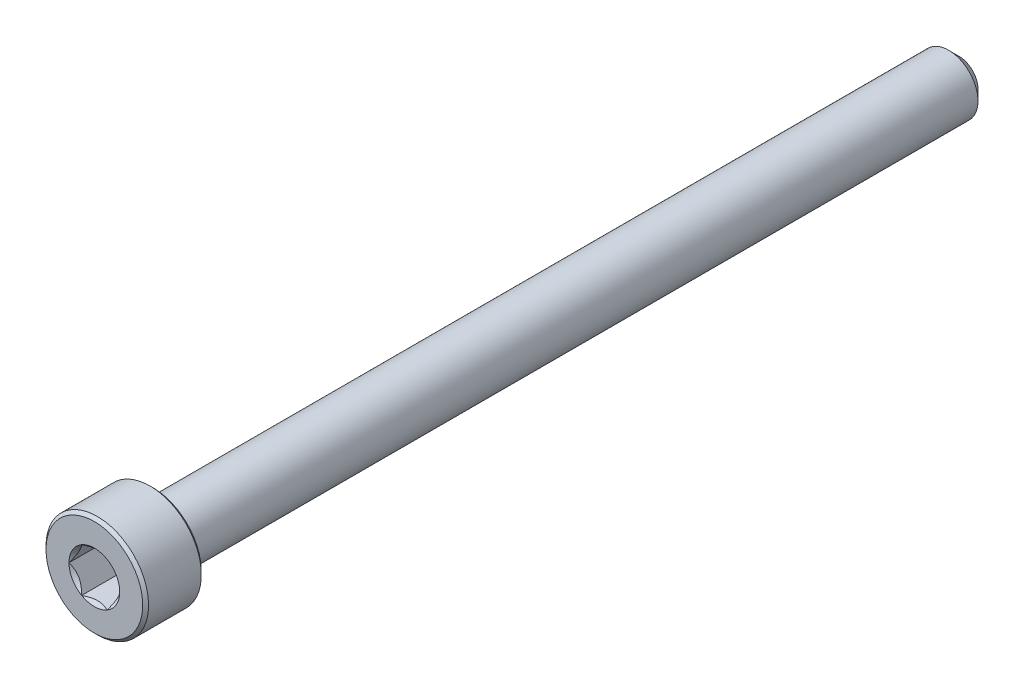
ISO-10303-21;
HEADER;
FILE_DESCRIPTION(('STEP AP214'),'2;1');
FILE_NAME('part.step','',(''),(''),'','','');
FILE_SCHEMA(('AUTOMOTIVE_DESIGN { 1 0 10303 214 1 1 1 1 }'));
ENDSEC;
DATA;
#1=APPLICATION_CONTEXT('core data for automotive mechanical design processes');
#2=APPLICATION_PROTOCOL_DEFINITION('international standard','automotive_design',2000,#1);
#3=PRODUCT_CONTEXT('',#1,'mechanical');
#4=PRODUCT('Part','Part','',(#3));
#5=PRODUCT_RELATED_PRODUCT_CATEGORY('part','',(#4));
#6=PRODUCT_DEFINITION_FORMATION('','',#4);
#7=PRODUCT_DEFINITION_CONTEXT('part definition',#1,'design');
#8=PRODUCT_DEFINITION('design','',#6,#7);
#9=PRODUCT_DEFINITION_SHAPE('','',#8);
#10=(LENGTH_UNIT() NAMED_UNIT(*) SI_UNIT(.MILLI.,.METRE.));
#11=(NAMED_UNIT(*) PLANE_ANGLE_UNIT() SI_UNIT($,.RADIAN.));
#12=(NAMED_UNIT(*) SI_UNIT($,.STERADIAN.) SOLID_ANGLE_UNIT());
#13=UNCERTAINTY_MEASURE_WITH_UNIT(LENGTH_MEASURE(1.E-05),#10,'distance_accuracy_value','');
#14=(GEOMETRIC_REPRESENTATION_CONTEXT(3) GLOBAL_UNCERTAINTY_ASSIGNED_CONTEXT((#13)) GLOBAL_UNIT_ASSIGNED_CONTEXT((#10,
#11,#12)) REPRESENTATION_CONTEXT('',''));
#15=CARTESIAN_POINT('',(0.,0.,0.));
#16=DIRECTION('',(0.,0.,1.));
#17=DIRECTION('',(1.,0.,0.));
#18=AXIS2_PLACEMENT_3D('',#15,#16,#17);
#19=CARTESIAN_POINT('',(0.,0.,29.5));
#20=DIRECTION('',(0.,0.,1.));
#21=DIRECTION('',(1.,0.,0.));
#22=AXIS2_PLACEMENT_3D('',#19,#20,#21);
#23=PLANE('',#22);
#24=CARTESIAN_POINT('',(0.,0.,29.5));
#25=DIRECTION('',(0.,0.,1.));
#26=DIRECTION('',(1.,0.,0.));
#27=AXIS2_PLACEMENT_3D('',#24,#25,#26);
#28=CIRCLE('',#27,1.73205080756888);
#29=CARTESIAN_POINT('',(1.73205080756888,0.,29.5));
#30=VERTEX_POINT('',#29);
#31=CARTESIAN_POINT('',(0.866025403784439,1.5,29.5));
#32=VERTEX_POINT('',#31);
#33=EDGE_CURVE('E112',#30,#32,#28,.T.);
#34=ORIENTED_EDGE('',*,*,#33,.F.);
#35=CARTESIAN_POINT('',(0.866025403784438,-1.5,29.5));
#36=VERTEX_POINT('',#35);
#37=EDGE_CURVE('E101',#36,#30,#28,.T.);
#38=ORIENTED_EDGE('',*,*,#37,.F.);
#39=CARTESIAN_POINT('',(-0.866025403784438,-1.5,29.5));
#40=VERTEX_POINT('',#39);
#41=EDGE_CURVE('E110',#40,#36,#28,.T.);
#42=ORIENTED_EDGE('',*,*,#41,.F.);
#43=CARTESIAN_POINT('',(-1.73205080756888,0.,29.5));
#44=VERTEX_POINT('',#43);
#45=EDGE_CURVE('E298',#44,#40,#28,.T.);
#46=ORIENTED_EDGE('',*,*,#45,.F.);
#47=CARTESIAN_POINT('',(-0.866025403784438,1.5,29.5));
#48=VERTEX_POINT('',#47);
#49=EDGE_CURVE('E138',#48,#44,#28,.T.);
#50=ORIENTED_EDGE('',*,*,#49,.F.);
#51=EDGE_CURVE('E135',#32,#48,#28,.T.);
#52=ORIENTED_EDGE('',*,*,#51,.F.);
#53=EDGE_LOOP('',(#34,#38,#42,#46,#50,#52));
#54=FACE_BOUND('',#53,.T.);
#55=CARTESIAN_POINT('',(0.,0.,29.5));
#56=DIRECTION('',(0.,0.,-1.));
#57=DIRECTION('',(-1.,0.,0.));
#58=AXIS2_PLACEMENT_3D('',#55,#56,#57);
#59=CIRCLE('',#58,3.3);
#60=CARTESIAN_POINT('',(-3.3,0.,29.5));
#61=VERTEX_POINT('',#60);
#62=EDGE_CURVE('E55',#61,#61,#59,.T.);
#63=ORIENTED_EDGE('',*,*,#62,.F.);
#64=EDGE_LOOP('',(#63));
#65=FACE_BOUND('',#64,.T.);
#66=ADVANCED_FACE('F41',(#54,#65),#23,.T.);
#67=CARTESIAN_POINT('',(0.,0.,29.3));
#68=DIRECTION('',(0.,0.,-1.));
#69=DIRECTION('',(-1.,0.,0.));
#70=AXIS2_PLACEMENT_3D('',#67,#68,#69);
#71=CONICAL_SURFACE('',#70,3.5,0.785398163397453);
#72=ORIENTED_EDGE('',*,*,#62,.T.);
#73=EDGE_LOOP('',(#72));
#74=FACE_BOUND('',#73,.T.);
#75=CARTESIAN_POINT('',(0.,0.,29.3));
#76=DIRECTION('',(0.,0.,-1.));
#77=DIRECTION('',(-1.,0.,0.));
#78=AXIS2_PLACEMENT_3D('',#75,#76,#77);
#79=CIRCLE('',#78,3.5);
#80=CARTESIAN_POINT('',(-3.5,0.,29.3));
#81=VERTEX_POINT('',#80);
#82=EDGE_CURVE('E233',#81,#81,#79,.T.);
#83=ORIENTED_EDGE('',*,*,#82,.F.);
#84=EDGE_LOOP('',(#83));
#85=FACE_BOUND('',#84,.T.);
#86=ADVANCED_FACE('F221',(#74,#85),#71,.T.);
#87=CARTESIAN_POINT('',(0.,0.,-29.5));
#88=DIRECTION('',(0.,0.,-1.));
#89=DIRECTION('',(-1.,0.,0.));
#90=AXIS2_PLACEMENT_3D('',#87,#88,#89);
#91=CYLINDRICAL_SURFACE('',#90,3.5);
#92=ORIENTED_EDGE('',*,*,#82,.T.);
#93=EDGE_LOOP('',(#92));
#94=FACE_BOUND('',#93,.T.);
#95=CARTESIAN_POINT('',(0.,0.,25.7));
#96=DIRECTION('',(0.,0.,-1.));
#97=DIRECTION('',(-1.,0.,0.));
#98=AXIS2_PLACEMENT_3D('',#95,#96,#97);
#99=CIRCLE('',#98,3.5);
#100=CARTESIAN_POINT('',(-3.5,0.,25.7));
#101=VERTEX_POINT('',#100);
#102=EDGE_CURVE('E235',#101,#101,#99,.T.);
#103=ORIENTED_EDGE('',*,*,#102,.F.);
#104=EDGE_LOOP('',(#103));
#105=FACE_BOUND('',#104,.T.);
#106=ADVANCED_FACE('F218',(#94,#105),#91,.T.);
#107=CARTESIAN_POINT('',(0.,0.,25.5));
#108=DIRECTION('',(0.,0.,1.));
#109=DIRECTION('',(1.,0.,0.));
#110=AXIS2_PLACEMENT_3D('',#107,#108,#109);
#111=CONICAL_SURFACE('',#110,3.3,0.785398163397454);
#112=ORIENTED_EDGE('',*,*,#102,.T.);
#113=EDGE_LOOP('',(#112));
#114=FACE_BOUND('',#113,.T.);
#115=CARTESIAN_POINT('',(0.,0.,25.5));
#116=DIRECTION('',(0.,0.,-1.));
#117=DIRECTION('',(-1.,0.,0.));
#118=AXIS2_PLACEMENT_3D('',#115,#116,#117);
#119=CIRCLE('',#118,3.3);
#120=CARTESIAN_POINT('',(-3.3,0.,25.5));
#121=VERTEX_POINT('',#120);
#122=EDGE_CURVE('E240',#121,#121,#119,.T.);
#123=ORIENTED_EDGE('',*,*,#122,.F.);
#124=EDGE_LOOP('',(#123));
#125=FACE_BOUND('',#124,.T.);
#126=ADVANCED_FACE('F214',(#114,#125),#111,.T.);
#127=CARTESIAN_POINT('',(0.,3.3,25.5));
#128=DIRECTION('',(0.,0.,-1.));
#129=DIRECTION('',(-1.,0.,0.));
#130=AXIS2_PLACEMENT_3D('',#127,#128,#129);
#131=PLANE('',#130);
#132=ORIENTED_EDGE('',*,*,#122,.T.);
#133=EDGE_LOOP('',(#132));
#134=FACE_BOUND('',#133,.T.);
#135=CARTESIAN_POINT('',(0.,0.,25.5));
#136=DIRECTION('',(0.,0.,-1.));
#137=DIRECTION('',(-1.,0.,0.));
#138=AXIS2_PLACEMENT_3D('',#135,#136,#137);
#139=CIRCLE('',#138,2.);
#140=CARTESIAN_POINT('',(-2.,0.,25.5));
#141=VERTEX_POINT('',#140);
#142=EDGE_CURVE('E246',#141,#141,#139,.T.);
#143=ORIENTED_EDGE('',*,*,#142,.F.);
#144=EDGE_LOOP('',(#143));
#145=FACE_BOUND('',#144,.T.);
#146=ADVANCED_FACE('F210',(#134,#145),#131,.T.);
#147=CARTESIAN_POINT('',(0.,0.,-29.5));
#148=DIRECTION('',(0.,0.,-1.));
#149=DIRECTION('',(-1.,0.,0.));
#150=AXIS2_PLACEMENT_3D('',#147,#148,#149);
#151=CYLINDRICAL_SURFACE('',#150,2.);
#152=ORIENTED_EDGE('',*,*,#142,.T.);
#153=EDGE_LOOP('',(#152));
#154=FACE_BOUND('',#153,.T.);
#155=CARTESIAN_POINT('',(0.,0.,-28.8));
#156=DIRECTION('',(0.,0.,-1.));
#157=DIRECTION('',(-1.,0.,0.));
#158=AXIS2_PLACEMENT_3D('',#155,#156,#157);
#159=CIRCLE('',#158,2.);
#160=CARTESIAN_POINT('',(-2.,0.,-28.8));
#161=VERTEX_POINT('',#160);
#162=EDGE_CURVE('E250',#161,#161,#159,.T.);
#163=ORIENTED_EDGE('',*,*,#162,.F.);
#164=EDGE_LOOP('',(#163));
#165=FACE_BOUND('',#164,.T.);
#166=ADVANCED_FACE('F206',(#154,#165),#151,.T.);
#167=CARTESIAN_POINT('',(0.,0.,-29.5));
#168=DIRECTION('',(0.,0.,1.));
#169=DIRECTION('',(1.,0.,0.));
#170=AXIS2_PLACEMENT_3D('',#167,#168,#169);
#171=CONICAL_SURFACE('',#170,1.3,0.78539816339744);
#172=ORIENTED_EDGE('',*,*,#162,.T.);
#173=EDGE_LOOP('',(#172));
#174=FACE_BOUND('',#173,.T.);
#175=CARTESIAN_POINT('',(0.,0.,-29.5));
#176=DIRECTION('',(0.,0.,-1.));
#177=DIRECTION('',(-1.,0.,0.));
#178=AXIS2_PLACEMENT_3D('',#175,#176,#177);
#179=CIRCLE('',#178,1.3);
#180=CARTESIAN_POINT('',(-1.3,0.,-29.5));
#181=VERTEX_POINT('',#180);
#182=EDGE_CURVE('E254',#181,#181,#179,.T.);
#183=ORIENTED_EDGE('',*,*,#182,.F.);
#184=EDGE_LOOP('',(#183));
#185=FACE_BOUND('',#184,.T.);
#186=ADVANCED_FACE('F202',(#174,#185),#171,.T.);
#187=CARTESIAN_POINT('',(0.,1.3,-29.5));
#188=DIRECTION('',(0.,0.,-1.));
#189=DIRECTION('',(-1.,0.,0.));
#190=AXIS2_PLACEMENT_3D('',#187,#188,#189);
#191=PLANE('',#190);
#192=ORIENTED_EDGE('',*,*,#182,.T.);
#193=EDGE_LOOP('',(#192));
#194=FACE_BOUND('',#193,.T.);
#195=ADVANCED_FACE('F199',(#194),#191,.T.);
#196=CARTESIAN_POINT('',(0.,0.,29.5));
#197=DIRECTION('',(0.,0.,1.));
#198=DIRECTION('',(1.,0.,0.));
#199=AXIS2_PLACEMENT_3D('',#196,#197,#198);
#200=CONICAL_SURFACE('',#199,1.73205080756888,0.78539816339745);
#201=ORIENTED_EDGE('',*,*,#33,.T.);
#202=CARTESIAN_POINT('',(1.73216627762272,-0.000200000000000874,29.5001154816001));
#203=CARTESIAN_POINT('',(1.70239359975915,0.0513677907370746,29.4703654760673));
#204=CARTESIAN_POINT('',(1.67212305186355,0.1037979176652,29.4423624839103));
#205=CARTESIAN_POINT('',(1.61039789003619,0.210709034055596,29.3910892304401));
#206=CARTESIAN_POINT('',(1.57893740312614,0.265200195814661,29.3678475050444));
#207=CARTESIAN_POINT('',(1.51549879897987,0.375079081357249,29.3280337289922));
#208=CARTESIAN_POINT('',(1.4835368452681,0.4304388090952,29.3113615856709));
#209=CARTESIAN_POINT('',(1.41890915196211,0.542377257477152,29.2856744568181));
#210=CARTESIAN_POINT('',(1.38624538781118,0.59895255655301,29.2766402904789));
#211=CARTESIAN_POINT('',(1.32995210095299,0.696455389516443,29.2684890812268));
#212=CARTESIAN_POINT('',(1.30639533311124,0.737256908280468,29.2672822529892));
#213=CARTESIAN_POINT('',(1.25932335290193,0.81878796961586,29.2693140571623));
#214=CARTESIAN_POINT('',(1.23580815085313,0.859517494314632,29.2725536707483));
#215=CARTESIAN_POINT('',(1.18900414978426,0.940584402163418,29.283291985982));
#216=CARTESIAN_POINT('',(1.16571558211719,0.980921384598291,29.2907946530187));
#217=CARTESIAN_POINT('',(1.11952932016335,1.06091833691403,29.3096516119283));
#218=CARTESIAN_POINT('',(1.09663179808786,1.10057800851621,29.3210075570186));
#219=CARTESIAN_POINT('',(1.03798159809698,1.20216313477449,29.3547216475927));
#220=CARTESIAN_POINT('',(1.00259267147465,1.26345855370969,29.3796218490934));
#221=CARTESIAN_POINT('',(0.950557780604374,1.35358562846331,29.4216566532716));
#222=CARTESIAN_POINT('',(0.933410759677147,1.38328513990772,29.4364251535591));
#223=CARTESIAN_POINT('',(0.899432101996406,1.44213790138375,29.4673105659402));
#224=CARTESIAN_POINT('',(0.88260031928571,1.47129140422064,29.4834268341217));
#225=CARTESIAN_POINT('',(0.865909933730601,1.5002,29.5001154816001));
#226=B_SPLINE_CURVE_WITH_KNOTS('',3,(#202,#203,#204,#205,#206,#207,#208,#209,#210,#211,#212,
#213,#214,#215,#216,#217,#218,#219,#220,#221,#222,#223,#224,#225),.UNSPECIFIED.,.F.,.F.,(4,2,2,
2,2,2,2,2,2,2,2,4),(0.,0.199829143693305,0.40082298738239,0.598623720538184,0.795926240188893,
0.937113067959885,1.07833105577193,1.21968061668222,1.36109089931055,1.58570969637566,
1.69770705470964,1.80965120737194),.UNSPECIFIED.);
#227=EDGE_CURVE('E12',#30,#32,#226,.T.);
#228=ORIENTED_EDGE('',*,*,#227,.F.);
#229=EDGE_LOOP('',(#201,#228));
#230=FACE_BOUND('',#229,.T.);
#231=ADVANCED_FACE('F114',(#230),#200,.F.);
#232=ORIENTED_EDGE('',*,*,#37,.T.);
#233=CARTESIAN_POINT('',(0.8659099337306,-1.5002,29.5001154816001));
#234=CARTESIAN_POINT('',(0.895682611594165,-1.44863220926293,29.4703654760673));
#235=CARTESIAN_POINT('',(0.925953159489764,-1.3962020823348,29.4423624839103));
#236=CARTESIAN_POINT('',(0.987678321317123,-1.2892909659444,29.3910892304401));
#237=CARTESIAN_POINT('',(1.01913880822717,-1.23479980418534,29.3678475050444));
#238=CARTESIAN_POINT('',(1.08257741237344,-1.12492091864275,29.3280337289922));
#239=CARTESIAN_POINT('',(1.11453936608521,-1.0695611909048,29.3113615856709));
#240=CARTESIAN_POINT('',(1.1791670593912,-0.957622742522849,29.2856744568181));
#241=CARTESIAN_POINT('',(1.21183082354213,-0.901047443446991,29.2766402904789));
#242=CARTESIAN_POINT('',(1.26812411040032,-0.803544610483558,29.2684890812268));
#243=CARTESIAN_POINT('',(1.29168087824208,-0.762743091719533,29.2672822529892));
#244=CARTESIAN_POINT('',(1.33875285845138,-0.681212030384141,29.2693140571623));
#245=CARTESIAN_POINT('',(1.36226806050018,-0.640482505685369,29.2725536707483));
#246=CARTESIAN_POINT('',(1.40907206156905,-0.559415597836583,29.283291985982));
#247=CARTESIAN_POINT('',(1.43236062923612,-0.51907861540171,29.2907946530187));
#248=CARTESIAN_POINT('',(1.47854689118997,-0.439081663085968,29.3096516119283));
#249=CARTESIAN_POINT('',(1.50144441326545,-0.399421991483791,29.3210075570186));
#250=CARTESIAN_POINT('',(1.56009461325633,-0.297836865225514,29.3547216475927));
#251=CARTESIAN_POINT('',(1.59548353987866,-0.23654144629031,29.3796218490934));
#252=CARTESIAN_POINT('',(1.64751843074894,-0.146414371536685,29.4216566532716));
#253=CARTESIAN_POINT('',(1.66466545167617,-0.116714860092281,29.4364251535591));
#254=CARTESIAN_POINT('',(1.69864410935691,-0.0578620986162484,29.4673105659402));
#255=CARTESIAN_POINT('',(1.71547589206761,-0.0287085957793627,29.4834268341217));
#256=CARTESIAN_POINT('',(1.73216627762272,0.000199999999999534,29.5001154816001));
#257=B_SPLINE_CURVE_WITH_KNOTS('',3,(#233,#234,#235,#236,#237,#238,#239,#240,#241,#242,#243,
#244,#245,#246,#247,#248,#249,#250,#251,#252,#253,#254,#255,#256),.UNSPECIFIED.,.F.,.F.,(4,2,2,
2,2,2,2,2,2,2,2,4),(0.,0.199829143693305,0.40082298738239,0.598623720538183,0.795926240188891,
0.937113067959884,1.07833105577193,1.21968061668222,1.36109089931055,1.58570969637566,
1.69770705470964,1.80965120737194),.UNSPECIFIED.);
#258=EDGE_CURVE('E104',#36,#30,#257,.T.);
#259=ORIENTED_EDGE('',*,*,#258,.F.);
#260=EDGE_LOOP('',(#232,#259));
#261=FACE_BOUND('',#260,.T.);
#262=ADVANCED_FACE('F103',(#261),#200,.F.);
#263=ORIENTED_EDGE('',*,*,#41,.T.);
#264=CARTESIAN_POINT('',(-1.72720812969692,-1.5,30.0555785162708));
#265=CARTESIAN_POINT('',(-1.68515175699268,-1.5,30.0238299078574));
#266=CARTESIAN_POINT('',(-1.64286104748674,-1.5,29.9923925938074));
#267=CARTESIAN_POINT('',(-1.55771581035942,-1.5,29.9302690875564));
#268=CARTESIAN_POINT('',(-1.51486114386668,-1.5,29.8995830858922));
#269=CARTESIAN_POINT('',(-1.3846813415127,-1.5,29.8084071924272));
#270=CARTESIAN_POINT('',(-1.29637976071654,-1.5,29.7492883434268));
#271=CARTESIAN_POINT('',(-1.11121478730467,-1.5,29.6332309963165));
#272=CARTESIAN_POINT('',(-1.01415038238167,-1.5,29.576609558733));
#273=CARTESIAN_POINT('',(-0.815173408897604,-1.5,29.4730368812657));
#274=CARTESIAN_POINT('',(-0.713278669253283,-1.5,29.4260530415417));
#275=CARTESIAN_POINT('',(-0.56033377494311,-1.5,29.3685726684308));
#276=CARTESIAN_POINT('',(-0.511547982948041,-1.5,29.3520753877572));
#277=CARTESIAN_POINT('',(-0.412798620136866,-1.5,29.322997512927));
#278=CARTESIAN_POINT('',(-0.362834968437563,-1.5,29.310417188594));
#279=CARTESIAN_POINT('',(-0.262863235444982,-1.5,29.2900361941468));
#280=CARTESIAN_POINT('',(-0.212872113808023,-1.5,29.282153632746));
#281=CARTESIAN_POINT('',(-0.112355243569546,-1.5,29.271322063969));
#282=CARTESIAN_POINT('',(-0.0618295883726286,-1.5,29.2683722085243));
#283=CARTESIAN_POINT('',(0.0374291733323834,-1.5,29.2676248577248));
#284=CARTESIAN_POINT('',(0.0861609672002981,-1.5,29.2696447335581));
#285=CARTESIAN_POINT('',(0.183206937768826,-1.5,29.2783225528968));
#286=CARTESIAN_POINT('',(0.231521073438268,-1.5,29.2849809469685));
#287=CARTESIAN_POINT('',(0.328199853425434,-1.5,29.3026852441226));
#288=CARTESIAN_POINT('',(0.376550616310327,-1.5,29.313805811257));
#289=CARTESIAN_POINT('',(0.472195697125598,-1.5,29.3398434140487));
#290=CARTESIAN_POINT('',(0.51949010309274,-1.5,29.3547601320409));
#291=CARTESIAN_POINT('',(0.668391282696623,-1.5,29.4073352235961));
#292=CARTESIAN_POINT('',(0.767878709508551,-1.5,29.450981287472));
#293=CARTESIAN_POINT('',(0.962179866690722,-1.5,29.5480229945931));
#294=CARTESIAN_POINT('',(1.05697519961444,-1.5,29.6014536650895));
#295=CARTESIAN_POINT('',(1.23814273533383,-1.5,29.7116858520046));
#296=CARTESIAN_POINT('',(1.32469942181289,-1.5,29.7681879206986));
#297=CARTESIAN_POINT('',(1.45222331290673,-1.5,29.8555343015787));
#298=CARTESIAN_POINT('',(1.49418091978756,-1.5,29.88495775868));
#299=CARTESIAN_POINT('',(1.57752272931476,-1.5,29.9445828218305));
#300=CARTESIAN_POINT('',(1.61890708647354,-1.5,29.9747842116644));
#301=CARTESIAN_POINT('',(1.66005278019494,-1.5,30.0053081786095));
#302=B_SPLINE_CURVE_WITH_KNOTS('',3,(#264,#265,#266,#267,#268,#269,#270,#271,#272,#273,#274,
#275,#276,#277,#278,#279,#280,#281,#282,#283,#284,#285,#286,#287,#288,#289,#290,#291,#292,#293,
#294,#295,#296,#297,#298,#299,#300,#301),.UNSPECIFIED.,.F.,.F.,(4,2,2,2,2,2,2,2,2,2,2,2,2,2,2,2,
2,2,4),(0.,0.158079548982667,0.31619878099394,0.634850417346958,0.971690311361509,
1.30737131660667,1.46173961127089,1.61611853740677,1.76772101421409,1.91929742368538,
2.065387412096,2.21149159305544,2.36014984633872,2.50879566386709,2.83376031422673,
3.15991186985651,3.46985601802197,3.62358896039973,3.7772796264207),.UNSPECIFIED.);
#303=EDGE_CURVE('E124',#40,#36,#302,.T.);
#304=ORIENTED_EDGE('',*,*,#303,.F.);
#305=EDGE_LOOP('',(#263,#304));
#306=FACE_BOUND('',#305,.T.);
#307=ADVANCED_FACE('F307',(#306),#200,.F.);
#308=ORIENTED_EDGE('',*,*,#45,.T.);
#309=CARTESIAN_POINT('',(-1.73216627762272,0.000200000000000134,29.5001154816001));
#310=CARTESIAN_POINT('',(-1.70239359975915,-0.0513677907370754,29.4703654760673));
#311=CARTESIAN_POINT('',(-1.67212305186355,-0.103797917665201,29.4423624839103));
#312=CARTESIAN_POINT('',(-1.61039789003619,-0.210709034055597,29.3910892304401));
#313=CARTESIAN_POINT('',(-1.57893740312614,-0.265200195814662,29.3678475050444));
#314=CARTESIAN_POINT('',(-1.51549879897987,-0.37507908135725,29.3280337289922));
#315=CARTESIAN_POINT('',(-1.4835368452681,-0.430438809095201,29.3113615856709));
#316=CARTESIAN_POINT('',(-1.41890915196211,-0.542377257477152,29.2856744568181));
#317=CARTESIAN_POINT('',(-1.38624538781118,-0.59895255655301,29.2766402904789));
#318=CARTESIAN_POINT('',(-1.32995210095299,-0.696455389516442,29.2684890812268));
#319=CARTESIAN_POINT('',(-1.30639533311124,-0.737256908280468,29.2672822529892));
#320=CARTESIAN_POINT('',(-1.25932335290193,-0.818787969615859,29.2693140571623));
#321=CARTESIAN_POINT('',(-1.23580815085313,-0.859517494314631,29.2725536707483));
#322=CARTESIAN_POINT('',(-1.18900414978427,-0.940584402163417,29.283291985982));
#323=CARTESIAN_POINT('',(-1.16571558211719,-0.98092138459829,29.2907946530187));
#324=CARTESIAN_POINT('',(-1.11952932016335,-1.06091833691403,29.3096516119283));
#325=CARTESIAN_POINT('',(-1.09663179808786,-1.10057800851621,29.3210075570186));
#326=CARTESIAN_POINT('',(-1.03798159809698,-1.20216313477449,29.3547216475927));
#327=CARTESIAN_POINT('',(-1.00259267147465,-1.26345855370969,29.3796218490934));
#328=CARTESIAN_POINT('',(-0.950557780604374,-1.35358562846332,29.4216566532716));
#329=CARTESIAN_POINT('',(-0.933410759677147,-1.38328513990772,29.4364251535591));
#330=CARTESIAN_POINT('',(-0.899432101996406,-1.44213790138375,29.4673105659402));
#331=CARTESIAN_POINT('',(-0.88260031928571,-1.47129140422064,29.4834268341217));
#332=CARTESIAN_POINT('',(-0.865909933730601,-1.5002,29.5001154816001));
#333=B_SPLINE_CURVE_WITH_KNOTS('',3,(#309,#310,#311,#312,#313,#314,#315,#316,#317,#318,#319,
#320,#321,#322,#323,#324,#325,#326,#327,#328,#329,#330,#331,#332),.UNSPECIFIED.,.F.,.F.,(4,2,2,
2,2,2,2,2,2,2,2,4),(0.,0.199829143693306,0.40082298738239,0.598623720538183,0.795926240188891,
0.937113067959883,1.07833105577193,1.21968061668222,1.36109089931055,1.58570969637566,
1.69770705470964,1.80965120737194),.UNSPECIFIED.);
#334=EDGE_CURVE('E164',#44,#40,#333,.T.);
#335=ORIENTED_EDGE('',*,*,#334,.F.);
#336=EDGE_LOOP('',(#308,#335));
#337=FACE_BOUND('',#336,.T.);
#338=ADVANCED_FACE('F342',(#337),#200,.F.);
#339=ORIENTED_EDGE('',*,*,#49,.T.);
#340=CARTESIAN_POINT('',(-0.865909933730601,1.5002,29.5001154816001));
#341=CARTESIAN_POINT('',(-0.895682611594165,1.44863220926292,29.4703654760673));
#342=CARTESIAN_POINT('',(-0.925953159489764,1.3962020823348,29.4423624839103));
#343=CARTESIAN_POINT('',(-0.987678321317123,1.2892909659444,29.3910892304401));
#344=CARTESIAN_POINT('',(-1.01913880822717,1.23479980418534,29.3678475050444));
#345=CARTESIAN_POINT('',(-1.08257741237344,1.12492091864275,29.3280337289922));
#346=CARTESIAN_POINT('',(-1.11453936608521,1.0695611909048,29.3113615856709));
#347=CARTESIAN_POINT('',(-1.1791670593912,0.957622742522849,29.2856744568181));
#348=CARTESIAN_POINT('',(-1.21183082354213,0.901047443446991,29.2766402904789));
#349=CARTESIAN_POINT('',(-1.26812411040032,0.803544610483558,29.2684890812268));
#350=CARTESIAN_POINT('',(-1.29168087824208,0.762743091719533,29.2672822529892));
#351=CARTESIAN_POINT('',(-1.33875285845138,0.68121203038414,29.2693140571623));
#352=CARTESIAN_POINT('',(-1.36226806050018,0.640482505685369,29.2725536707483));
#353=CARTESIAN_POINT('',(-1.40907206156905,0.559415597836583,29.283291985982));
#354=CARTESIAN_POINT('',(-1.43236062923612,0.51907861540171,29.2907946530187));
#355=CARTESIAN_POINT('',(-1.47854689118997,0.439081663085968,29.3096516119283));
#356=CARTESIAN_POINT('',(-1.50144441326545,0.399421991483791,29.3210075570186));
#357=CARTESIAN_POINT('',(-1.56009461325633,0.297836865225514,29.3547216475927));
#358=CARTESIAN_POINT('',(-1.59548353987866,0.23654144629031,29.3796218490934));
#359=CARTESIAN_POINT('',(-1.64751843074894,0.146414371536685,29.4216566532716));
#360=CARTESIAN_POINT('',(-1.66466545167617,0.116714860092281,29.4364251535591));
#361=CARTESIAN_POINT('',(-1.69864410935691,0.0578620986162485,29.4673105659402));
#362=CARTESIAN_POINT('',(-1.71547589206761,0.0287085957793628,29.4834268341217));
#363=CARTESIAN_POINT('',(-1.73216627762272,-0.000199999999999435,29.5001154816001));
#364=B_SPLINE_CURVE_WITH_KNOTS('',3,(#340,#341,#342,#343,#344,#345,#346,#347,#348,#349,#350,
#351,#352,#353,#354,#355,#356,#357,#358,#359,#360,#361,#362,#363),.UNSPECIFIED.,.F.,.F.,(4,2,2,
2,2,2,2,2,2,2,2,4),(0.,0.199829143693305,0.40082298738239,0.598623720538182,0.795926240188891,
0.937113067959884,1.07833105577193,1.21968061668222,1.36109089931055,1.58570969637566,
1.69770705470964,1.80965120737194),.UNSPECIFIED.);
#365=EDGE_CURVE('E171',#48,#44,#364,.T.);
#366=ORIENTED_EDGE('',*,*,#365,.F.);
#367=EDGE_LOOP('',(#339,#366));
#368=FACE_BOUND('',#367,.T.);
#369=ADVANCED_FACE('F156',(#368),#200,.F.);
#370=ORIENTED_EDGE('',*,*,#51,.T.);
#371=CARTESIAN_POINT('',(-1.72720812969692,1.5,30.0555785162708));
#372=CARTESIAN_POINT('',(-1.68515175699267,1.5,30.0238299078574));
#373=CARTESIAN_POINT('',(-1.64286104748673,1.5,29.9923925938074));
#374=CARTESIAN_POINT('',(-1.55771581035942,1.5,29.9302690875564));
#375=CARTESIAN_POINT('',(-1.51486114386668,1.5,29.8995830858922));
#376=CARTESIAN_POINT('',(-1.3846813415127,1.5,29.8084071924272));
#377=CARTESIAN_POINT('',(-1.29637976071653,1.5,29.7492883434268));
#378=CARTESIAN_POINT('',(-1.11121478730467,1.5,29.6332309963165));
#379=CARTESIAN_POINT('',(-1.01415038238167,1.5,29.576609558733));
#380=CARTESIAN_POINT('',(-0.815173408897604,1.5,29.4730368812656));
#381=CARTESIAN_POINT('',(-0.713278669253283,1.5,29.4260530415417));
#382=CARTESIAN_POINT('',(-0.560333774943111,1.5,29.3685726684308));
#383=CARTESIAN_POINT('',(-0.511547982948041,1.5,29.3520753877572));
#384=CARTESIAN_POINT('',(-0.412798620136866,1.5,29.322997512927));
#385=CARTESIAN_POINT('',(-0.362834968437562,1.5,29.310417188594));
#386=CARTESIAN_POINT('',(-0.262863235444981,1.5,29.2900361941468));
#387=CARTESIAN_POINT('',(-0.212872113808021,1.5,29.282153632746));
#388=CARTESIAN_POINT('',(-0.112355243569544,1.5,29.271322063969));
#389=CARTESIAN_POINT('',(-0.061829588372626,1.5,29.2683722085243));
#390=CARTESIAN_POINT('',(0.037429173332386,1.5,29.2676248577248));
#391=CARTESIAN_POINT('',(0.0861609672003008,1.5,29.2696447335581));
#392=CARTESIAN_POINT('',(0.183206937768828,1.5,29.2783225528968));
#393=CARTESIAN_POINT('',(0.23152107343827,1.5,29.2849809469685));
#394=CARTESIAN_POINT('',(0.328199853425437,1.5,29.3026852441226));
#395=CARTESIAN_POINT('',(0.376550616310329,1.5,29.313805811257));
#396=CARTESIAN_POINT('',(0.472195697125599,1.5,29.3398434140487));
#397=CARTESIAN_POINT('',(0.519490103092741,1.5,29.3547601320409));
#398=CARTESIAN_POINT('',(0.668391282696625,1.5,29.4073352235961));
#399=CARTESIAN_POINT('',(0.767878709508554,1.5,29.450981287472));
#400=CARTESIAN_POINT('',(0.962179866690725,1.5,29.5480229945931));
#401=CARTESIAN_POINT('',(1.05697519961444,1.5,29.6014536650895));
#402=CARTESIAN_POINT('',(1.23814273533383,1.5,29.7116858520046));
#403=CARTESIAN_POINT('',(1.3246994218129,1.5,29.7681879206986));
#404=CARTESIAN_POINT('',(1.45222331290673,1.5,29.8555343015787));
#405=CARTESIAN_POINT('',(1.49418091978756,1.5,29.88495775868));
#406=CARTESIAN_POINT('',(1.57752272931476,1.5,29.9445828218305));
#407=CARTESIAN_POINT('',(1.61890708647354,1.5,29.9747842116644));
#408=CARTESIAN_POINT('',(1.66005278019494,1.5,30.0053081786095));
#409=B_SPLINE_CURVE_WITH_KNOTS('',3,(#371,#372,#373,#374,#375,#376,#377,#378,#379,#380,#381,
#382,#383,#384,#385,#386,#387,#388,#389,#390,#391,#392,#393,#394,#395,#396,#397,#398,#399,#400,
#401,#402,#403,#404,#405,#406,#407,#408),.UNSPECIFIED.,.F.,.F.,(4,2,2,2,2,2,2,2,2,2,2,2,2,2,2,2,
2,2,4),(0.,0.158079548982669,0.31619878099394,0.634850417346955,0.971690311361509,
1.30737131660667,1.46173961127088,1.61611853740677,1.76772101421409,1.91929742368538,
2.065387412096,2.21149159305544,2.36014984633872,2.50879566386709,2.83376031422673,
3.15991186985651,3.46985601802197,3.62358896039973,3.7772796264207),.UNSPECIFIED.);
#410=EDGE_CURVE('E61',#32,#48,#409,.F.);
#411=ORIENTED_EDGE('',*,*,#410,.F.);
#412=EDGE_LOOP('',(#370,#411));
#413=FACE_BOUND('',#412,.T.);
#414=ADVANCED_FACE('F152',(#413),#200,.F.);
#415=CARTESIAN_POINT('',(0.,3.3,26.5));
#416=DIRECTION('',(0.,0.,-1.));
#417=DIRECTION('',(-1.,0.,0.));
#418=AXIS2_PLACEMENT_3D('',#415,#416,#417);
#419=PLANE('',#418);
#420=DIRECTION('',(-0.5,0.866025403784439,0.));
#421=VECTOR('',#420,1.);
#422=CARTESIAN_POINT('',(1.73205080756888,0.,26.5));
#423=LINE('',#422,#421);
#424=CARTESIAN_POINT('',(1.73205080756888,0.,26.5));
#425=VERTEX_POINT('',#424);
#426=CARTESIAN_POINT('',(0.866025403784438,1.5,26.5));
#427=VERTEX_POINT('',#426);
#428=EDGE_CURVE('E128',#425,#427,#423,.T.);
#429=ORIENTED_EDGE('',*,*,#428,.T.);
#430=DIRECTION('',(-1.,0.,0.));
#431=VECTOR('',#430,1.);
#432=CARTESIAN_POINT('',(0.866025403784438,1.5,26.5));
#433=LINE('',#432,#431);
#434=CARTESIAN_POINT('',(-0.866025403784439,1.5,26.5));
#435=VERTEX_POINT('',#434);
#436=EDGE_CURVE('E266',#427,#435,#433,.T.);
#437=ORIENTED_EDGE('',*,*,#436,.T.);
#438=DIRECTION('',(-0.5,-0.866025403784438,0.));
#439=VECTOR('',#438,1.);
#440=CARTESIAN_POINT('',(-0.866025403784439,1.5,26.5));
#441=LINE('',#440,#439);
#442=CARTESIAN_POINT('',(-1.73205080756888,0.,26.5));
#443=VERTEX_POINT('',#442);
#444=EDGE_CURVE('E265',#435,#443,#441,.T.);
#445=ORIENTED_EDGE('',*,*,#444,.T.);
#446=DIRECTION('',(0.5,-0.866025403784439,0.));
#447=VECTOR('',#446,1.);
#448=CARTESIAN_POINT('',(-1.73205080756888,0.,26.5));
#449=LINE('',#448,#447);
#450=CARTESIAN_POINT('',(-0.866025403784439,-1.5,26.5));
#451=VERTEX_POINT('',#450);
#452=EDGE_CURVE('E271',#443,#451,#449,.T.);
#453=ORIENTED_EDGE('',*,*,#452,.T.);
#454=DIRECTION('',(1.,0.,0.));
#455=VECTOR('',#454,1.);
#456=CARTESIAN_POINT('',(-0.866025403784439,-1.5,26.5));
#457=LINE('',#456,#455);
#458=CARTESIAN_POINT('',(0.866025403784438,-1.5,26.5));
#459=VERTEX_POINT('',#458);
#460=EDGE_CURVE('E276',#451,#459,#457,.T.);
#461=ORIENTED_EDGE('',*,*,#460,.T.);
#462=DIRECTION('',(0.5,0.866025403784439,0.));
#463=VECTOR('',#462,1.);
#464=CARTESIAN_POINT('',(0.866025403784438,-1.5,26.5));
#465=LINE('',#464,#463);
#466=EDGE_CURVE('E130',#459,#425,#465,.T.);
#467=ORIENTED_EDGE('',*,*,#466,.T.);
#468=EDGE_LOOP('',(#429,#437,#445,#453,#461,#467));
#469=FACE_BOUND('',#468,.T.);
#470=ADVANCED_FACE('F155',(#469),#419,.F.);
#471=CARTESIAN_POINT('',(1.73205080756888,0.,20.9174243050442));
#472=DIRECTION('',(0.866025403784439,0.5,0.));
#473=DIRECTION('',(-0.5,0.866025403784439,0.));
#474=AXIS2_PLACEMENT_3D('',#471,#472,#473);
#475=PLANE('',#474);
#476=DIRECTION('',(0.,0.,1.));
#477=VECTOR('',#476,1.);
#478=CARTESIAN_POINT('',(1.73205080756888,0.,20.9174243050442));
#479=LINE('',#478,#477);
#480=EDGE_CURVE('E121',#425,#30,#479,.T.);
#481=ORIENTED_EDGE('',*,*,#480,.T.);
#482=ORIENTED_EDGE('',*,*,#227,.T.);
#483=DIRECTION('',(0.,0.,1.));
#484=VECTOR('',#483,1.);
#485=CARTESIAN_POINT('',(0.866025403784438,1.5,20.9174243050442));
#486=LINE('',#485,#484);
#487=EDGE_CURVE('E258',#427,#32,#486,.T.);
#488=ORIENTED_EDGE('',*,*,#487,.F.);
#489=ORIENTED_EDGE('',*,*,#428,.F.);
#490=EDGE_LOOP('',(#481,#482,#488,#489));
#491=FACE_BOUND('',#490,.T.);
#492=ADVANCED_FACE('F126',(#491),#475,.F.);
#493=CARTESIAN_POINT('',(0.866025403784438,-1.5,20.9174243050442));
#494=DIRECTION('',(0.866025403784438,-0.5,0.));
#495=DIRECTION('',(0.5,0.866025403784439,0.));
#496=AXIS2_PLACEMENT_3D('',#493,#494,#495);
#497=PLANE('',#496);
#498=DIRECTION('',(0.,0.,1.));
#499=VECTOR('',#498,1.);
#500=CARTESIAN_POINT('',(0.866025403784438,-1.5,20.9174243050442));
#501=LINE('',#500,#499);
#502=EDGE_CURVE('E69',#459,#36,#501,.T.);
#503=ORIENTED_EDGE('',*,*,#502,.T.);
#504=ORIENTED_EDGE('',*,*,#258,.T.);
#505=ORIENTED_EDGE('',*,*,#480,.F.);
#506=ORIENTED_EDGE('',*,*,#466,.F.);
#507=EDGE_LOOP('',(#503,#504,#505,#506));
#508=FACE_BOUND('',#507,.T.);
#509=ADVANCED_FACE('F120',(#508),#497,.F.);
#510=CARTESIAN_POINT('',(-0.866025403784439,-1.5,20.9174243050442));
#511=DIRECTION('',(0.,-1.,0.));
#512=DIRECTION('',(1.,0.,0.));
#513=AXIS2_PLACEMENT_3D('',#510,#511,#512);
#514=PLANE('',#513);
#515=DIRECTION('',(0.,0.,1.));
#516=VECTOR('',#515,1.);
#517=CARTESIAN_POINT('',(-0.866025403784439,-1.5,20.9174243050442));
#518=LINE('',#517,#516);
#519=EDGE_CURVE('E272',#451,#40,#518,.T.);
#520=ORIENTED_EDGE('',*,*,#519,.T.);
#521=ORIENTED_EDGE('',*,*,#303,.T.);
#522=ORIENTED_EDGE('',*,*,#502,.F.);
#523=ORIENTED_EDGE('',*,*,#460,.F.);
#524=EDGE_LOOP('',(#520,#521,#522,#523));
#525=FACE_BOUND('',#524,.T.);
#526=ADVANCED_FACE('F314',(#525),#514,.F.);
#527=CARTESIAN_POINT('',(-1.73205080756888,0.,20.9174243050442));
#528=DIRECTION('',(-0.866025403784439,-0.5,0.));
#529=DIRECTION('',(0.5,-0.866025403784439,0.));
#530=AXIS2_PLACEMENT_3D('',#527,#528,#529);
#531=PLANE('',#530);
#532=DIRECTION('',(0.,0.,1.));
#533=VECTOR('',#532,1.);
#534=CARTESIAN_POINT('',(-1.73205080756888,0.,20.9174243050442));
#535=LINE('',#534,#533);
#536=EDGE_CURVE('E267',#443,#44,#535,.T.);
#537=ORIENTED_EDGE('',*,*,#536,.T.);
#538=ORIENTED_EDGE('',*,*,#334,.T.);
#539=ORIENTED_EDGE('',*,*,#519,.F.);
#540=ORIENTED_EDGE('',*,*,#452,.F.);
#541=EDGE_LOOP('',(#537,#538,#539,#540));
#542=FACE_BOUND('',#541,.T.);
#543=ADVANCED_FACE('F189',(#542),#531,.F.);
#544=CARTESIAN_POINT('',(-0.866025403784439,1.5,20.9174243050442));
#545=DIRECTION('',(-0.866025403784438,0.5,0.));
#546=DIRECTION('',(-0.5,-0.866025403784438,0.));
#547=AXIS2_PLACEMENT_3D('',#544,#545,#546);
#548=PLANE('',#547);
#549=DIRECTION('',(0.,0.,1.));
#550=VECTOR('',#549,1.);
#551=CARTESIAN_POINT('',(-0.866025403784439,1.5,20.9174243050442));
#552=LINE('',#551,#550);
#553=EDGE_CURVE('E261',#435,#48,#552,.T.);
#554=ORIENTED_EDGE('',*,*,#553,.T.);
#555=ORIENTED_EDGE('',*,*,#365,.T.);
#556=ORIENTED_EDGE('',*,*,#536,.F.);
#557=ORIENTED_EDGE('',*,*,#444,.F.);
#558=EDGE_LOOP('',(#554,#555,#556,#557));
#559=FACE_BOUND('',#558,.T.);
#560=ADVANCED_FACE('F185',(#559),#548,.F.);
#561=CARTESIAN_POINT('',(0.866025403784438,1.5,20.9174243050442));
#562=DIRECTION('',(0.,1.,0.));
#563=DIRECTION('',(0.,0.,1.));
#564=AXIS2_PLACEMENT_3D('',#561,#562,#563);
#565=PLANE('',#564);
#566=ORIENTED_EDGE('',*,*,#487,.T.);
#567=ORIENTED_EDGE('',*,*,#410,.T.);
#568=ORIENTED_EDGE('',*,*,#553,.F.);
#569=ORIENTED_EDGE('',*,*,#436,.F.);
#570=EDGE_LOOP('',(#566,#567,#568,#569));
#571=FACE_BOUND('',#570,.T.);
#572=ADVANCED_FACE('F188',(#571),#565,.F.);
#573=CLOSED_SHELL('',(#66,#86,#106,#126,#146,#166,#186,#195,#231,#262,#307,#338,#369,#414,#470,
#492,#509,#526,#543,#560,#572));
#574=MANIFOLD_SOLID_BREP('B2',#573);
#575=ADVANCED_BREP_SHAPE_REPRESENTATION('',(#18,#574),#14);
#576=SHAPE_DEFINITION_REPRESENTATION(#9,#575);
ENDSEC;
END-ISO-10303-21;
